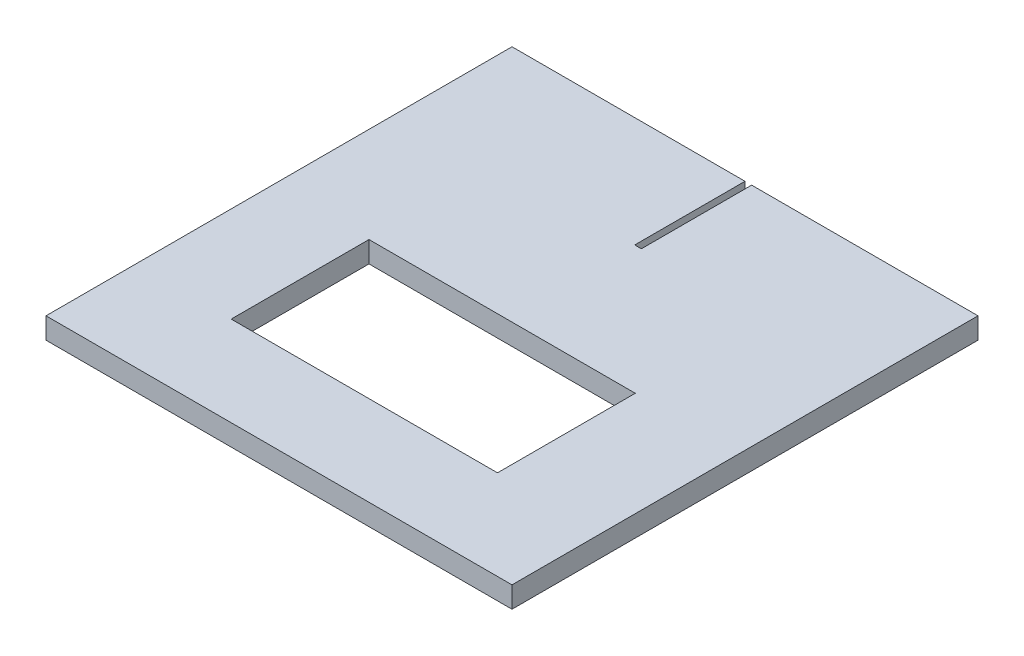
ISO-10303-21;
HEADER;
FILE_DESCRIPTION(('STEP AP214'),'2;1');
FILE_NAME('part.step','',(''),(''),'','','');
FILE_SCHEMA(('AUTOMOTIVE_DESIGN { 1 0 10303 214 1 1 1 1 }'));
ENDSEC;
DATA;
#1=APPLICATION_CONTEXT('core data for automotive mechanical design processes');
#2=APPLICATION_PROTOCOL_DEFINITION('international standard','automotive_design',2000,#1);
#3=PRODUCT_CONTEXT('',#1,'mechanical');
#4=PRODUCT('Part','Part','',(#3));
#5=PRODUCT_RELATED_PRODUCT_CATEGORY('part','',(#4));
#6=PRODUCT_DEFINITION_FORMATION('','',#4);
#7=PRODUCT_DEFINITION_CONTEXT('part definition',#1,'design');
#8=PRODUCT_DEFINITION('design','',#6,#7);
#9=PRODUCT_DEFINITION_SHAPE('','',#8);
#10=(LENGTH_UNIT() NAMED_UNIT(*) SI_UNIT(.MILLI.,.METRE.));
#11=(NAMED_UNIT(*) PLANE_ANGLE_UNIT() SI_UNIT($,.RADIAN.));
#12=(NAMED_UNIT(*) SI_UNIT($,.STERADIAN.) SOLID_ANGLE_UNIT());
#13=UNCERTAINTY_MEASURE_WITH_UNIT(LENGTH_MEASURE(1.E-05),#10,'distance_accuracy_value','');
#14=(GEOMETRIC_REPRESENTATION_CONTEXT(3) GLOBAL_UNCERTAINTY_ASSIGNED_CONTEXT((#13)) GLOBAL_UNIT_ASSIGNED_CONTEXT((#10,
#11,#12)) REPRESENTATION_CONTEXT('',''));
#15=CARTESIAN_POINT('',(0.,0.,0.));
#16=DIRECTION('',(0.,0.,1.));
#17=DIRECTION('',(1.,0.,0.));
#18=AXIS2_PLACEMENT_3D('',#15,#16,#17);
#19=CARTESIAN_POINT('',(-35.,3.175,-35.));
#20=DIRECTION('',(0.,0.,1.));
#21=DIRECTION('',(1.,0.,0.));
#22=AXIS2_PLACEMENT_3D('',#19,#20,#21);
#23=PLANE('',#22);
#24=DIRECTION('',(-1.,0.,0.));
#25=VECTOR('',#24,1.);
#26=CARTESIAN_POINT('',(-35.,3.175,-35.));
#27=LINE('',#26,#25);
#28=CARTESIAN_POINT('',(0.,3.175,-35.));
#29=VERTEX_POINT('',#28);
#30=CARTESIAN_POINT('',(-35.,3.175,-35.));
#31=VERTEX_POINT('',#30);
#32=EDGE_CURVE('E185',#29,#31,#27,.T.);
#33=ORIENTED_EDGE('',*,*,#32,.F.);
#34=DIRECTION('',(0.,1.,0.));
#35=VECTOR('',#34,1.);
#36=CARTESIAN_POINT('',(0.,0.,-35.));
#37=LINE('',#36,#35);
#38=CARTESIAN_POINT('',(0.,0.,-35.));
#39=VERTEX_POINT('',#38);
#40=EDGE_CURVE('E173',#39,#29,#37,.T.);
#41=ORIENTED_EDGE('',*,*,#40,.F.);
#42=DIRECTION('',(-1.,0.,0.));
#43=VECTOR('',#42,1.);
#44=CARTESIAN_POINT('',(-35.,0.,-35.));
#45=LINE('',#44,#43);
#46=CARTESIAN_POINT('',(-35.,0.,-35.));
#47=VERTEX_POINT('',#46);
#48=EDGE_CURVE('E197',#39,#47,#45,.T.);
#49=ORIENTED_EDGE('',*,*,#48,.T.);
#50=DIRECTION('',(0.,-1.,0.));
#51=VECTOR('',#50,1.);
#52=CARTESIAN_POINT('',(-35.,3.175,-35.));
#53=LINE('',#52,#51);
#54=EDGE_CURVE('E40',#31,#47,#53,.T.);
#55=ORIENTED_EDGE('',*,*,#54,.F.);
#56=EDGE_LOOP('',(#33,#41,#49,#55));
#57=FACE_BOUND('',#56,.T.);
#58=ADVANCED_FACE('F32',(#57),#23,.F.);
#59=CARTESIAN_POINT('',(35.,3.175,35.));
#60=DIRECTION('',(-1.,0.,0.));
#61=DIRECTION('',(0.,0.,1.));
#62=AXIS2_PLACEMENT_3D('',#59,#60,#61);
#63=PLANE('',#62);
#64=DIRECTION('',(0.,0.,-1.));
#65=VECTOR('',#64,1.);
#66=CARTESIAN_POINT('',(35.,0.,35.));
#67=LINE('',#66,#65);
#68=CARTESIAN_POINT('',(35.,0.,35.));
#69=VERTEX_POINT('',#68);
#70=CARTESIAN_POINT('',(35.,0.,-35.));
#71=VERTEX_POINT('',#70);
#72=EDGE_CURVE('E175',#69,#71,#67,.T.);
#73=ORIENTED_EDGE('',*,*,#72,.T.);
#74=DIRECTION('',(0.,-1.,0.));
#75=VECTOR('',#74,1.);
#76=CARTESIAN_POINT('',(35.,3.175,-35.));
#77=LINE('',#76,#75);
#78=CARTESIAN_POINT('',(35.,3.175,-35.));
#79=VERTEX_POINT('',#78);
#80=EDGE_CURVE('E11',#79,#71,#77,.T.);
#81=ORIENTED_EDGE('',*,*,#80,.F.);
#82=DIRECTION('',(0.,0.,-1.));
#83=VECTOR('',#82,1.);
#84=CARTESIAN_POINT('',(35.,3.175,35.));
#85=LINE('',#84,#83);
#86=CARTESIAN_POINT('',(35.,3.175,35.));
#87=VERTEX_POINT('',#86);
#88=EDGE_CURVE('E182',#87,#79,#85,.T.);
#89=ORIENTED_EDGE('',*,*,#88,.F.);
#90=DIRECTION('',(0.,-1.,0.));
#91=VECTOR('',#90,1.);
#92=CARTESIAN_POINT('',(35.,3.175,35.));
#93=LINE('',#92,#91);
#94=EDGE_CURVE('E194',#87,#69,#93,.T.);
#95=ORIENTED_EDGE('',*,*,#94,.T.);
#96=EDGE_LOOP('',(#73,#81,#89,#95));
#97=FACE_BOUND('',#96,.T.);
#98=ADVANCED_FACE('F34',(#97),#63,.F.);
#99=CARTESIAN_POINT('',(1.,0.,-35.));
#100=VERTEX_POINT('',#99);
#101=EDGE_CURVE('E198',#71,#100,#45,.T.);
#102=ORIENTED_EDGE('',*,*,#101,.T.);
#103=DIRECTION('',(0.,1.,0.));
#104=VECTOR('',#103,1.);
#105=CARTESIAN_POINT('',(1.,0.,-35.));
#106=LINE('',#105,#104);
#107=CARTESIAN_POINT('',(1.,3.175,-35.));
#108=VERTEX_POINT('',#107);
#109=EDGE_CURVE('E176',#100,#108,#106,.T.);
#110=ORIENTED_EDGE('',*,*,#109,.T.);
#111=EDGE_CURVE('E187',#79,#108,#27,.T.);
#112=ORIENTED_EDGE('',*,*,#111,.F.);
#113=ORIENTED_EDGE('',*,*,#80,.T.);
#114=EDGE_LOOP('',(#102,#110,#112,#113));
#115=FACE_BOUND('',#114,.T.);
#116=ADVANCED_FACE('F242',(#115),#23,.F.);
#117=CARTESIAN_POINT('',(-35.,3.175,35.));
#118=DIRECTION('',(1.,0.,0.));
#119=DIRECTION('',(0.,0.,-1.));
#120=AXIS2_PLACEMENT_3D('',#117,#118,#119);
#121=PLANE('',#120);
#122=DIRECTION('',(0.,0.,1.));
#123=VECTOR('',#122,1.);
#124=CARTESIAN_POINT('',(-35.,0.,35.));
#125=LINE('',#124,#123);
#126=CARTESIAN_POINT('',(-35.,0.,35.));
#127=VERTEX_POINT('',#126);
#128=EDGE_CURVE('E201',#47,#127,#125,.T.);
#129=ORIENTED_EDGE('',*,*,#128,.T.);
#130=DIRECTION('',(0.,-1.,0.));
#131=VECTOR('',#130,1.);
#132=CARTESIAN_POINT('',(-35.,3.175,35.));
#133=LINE('',#132,#131);
#134=CARTESIAN_POINT('',(-35.,3.175,35.));
#135=VERTEX_POINT('',#134);
#136=EDGE_CURVE('E206',#135,#127,#133,.T.);
#137=ORIENTED_EDGE('',*,*,#136,.F.);
#138=DIRECTION('',(0.,0.,1.));
#139=VECTOR('',#138,1.);
#140=CARTESIAN_POINT('',(-35.,3.175,35.));
#141=LINE('',#140,#139);
#142=EDGE_CURVE('E190',#31,#135,#141,.T.);
#143=ORIENTED_EDGE('',*,*,#142,.F.);
#144=ORIENTED_EDGE('',*,*,#54,.T.);
#145=EDGE_LOOP('',(#129,#137,#143,#144));
#146=FACE_BOUND('',#145,.T.);
#147=ADVANCED_FACE('F213',(#146),#121,.F.);
#148=CARTESIAN_POINT('',(-35.,3.175,35.));
#149=DIRECTION('',(0.,0.,-1.));
#150=DIRECTION('',(-1.,0.,0.));
#151=AXIS2_PLACEMENT_3D('',#148,#149,#150);
#152=PLANE('',#151);
#153=DIRECTION('',(1.,0.,0.));
#154=VECTOR('',#153,1.);
#155=CARTESIAN_POINT('',(-35.,0.,35.));
#156=LINE('',#155,#154);
#157=EDGE_CURVE('E186',#127,#69,#156,.T.);
#158=ORIENTED_EDGE('',*,*,#157,.T.);
#159=ORIENTED_EDGE('',*,*,#94,.F.);
#160=DIRECTION('',(1.,0.,0.));
#161=VECTOR('',#160,1.);
#162=CARTESIAN_POINT('',(-35.,3.175,35.));
#163=LINE('',#162,#161);
#164=EDGE_CURVE('E192',#135,#87,#163,.T.);
#165=ORIENTED_EDGE('',*,*,#164,.F.);
#166=ORIENTED_EDGE('',*,*,#136,.T.);
#167=EDGE_LOOP('',(#158,#159,#165,#166));
#168=FACE_BOUND('',#167,.T.);
#169=ADVANCED_FACE('F224',(#168),#152,.F.);
#170=CARTESIAN_POINT('',(0.,3.175,0.));
#171=DIRECTION('',(0.,-1.,0.));
#172=DIRECTION('',(0.,0.,-1.));
#173=AXIS2_PLACEMENT_3D('',#170,#171,#172);
#174=PLANE('',#173);
#175=DIRECTION('',(-1.,0.,0.));
#176=VECTOR('',#175,1.);
#177=CARTESIAN_POINT('',(19.337359504229,3.175,0.8181190559482));
#178=LINE('',#177,#176);
#179=CARTESIAN_POINT('',(19.337359504229,3.175,0.8181190559482));
#180=VERTEX_POINT('',#179);
#181=CARTESIAN_POINT('',(-20.662640495771,3.175,0.8181190559482));
#182=VERTEX_POINT('',#181);
#183=EDGE_CURVE('E126',#180,#182,#178,.T.);
#184=ORIENTED_EDGE('',*,*,#183,.F.);
#185=DIRECTION('',(0.,0.,1.));
#186=VECTOR('',#185,1.);
#187=CARTESIAN_POINT('',(19.337359504229,3.175,0.8181190559482));
#188=LINE('',#187,#186);
#189=CARTESIAN_POINT('',(19.337359504229,3.175,21.5181190559482));
#190=VERTEX_POINT('',#189);
#191=EDGE_CURVE('E123',#180,#190,#188,.T.);
#192=ORIENTED_EDGE('',*,*,#191,.T.);
#193=DIRECTION('',(-1.,0.,0.));
#194=VECTOR('',#193,1.);
#195=CARTESIAN_POINT('',(19.337359504229,3.175,21.5181190559482));
#196=LINE('',#195,#194);
#197=CARTESIAN_POINT('',(-20.662640495771,3.175,21.5181190559482));
#198=VERTEX_POINT('',#197);
#199=EDGE_CURVE('E129',#190,#198,#196,.T.);
#200=ORIENTED_EDGE('',*,*,#199,.T.);
#201=DIRECTION('',(0.,0.,1.));
#202=VECTOR('',#201,1.);
#203=CARTESIAN_POINT('',(-20.662640495771,3.175,0.8181190559482));
#204=LINE('',#203,#202);
#205=EDGE_CURVE('E133',#182,#198,#204,.T.);
#206=ORIENTED_EDGE('',*,*,#205,.F.);
#207=EDGE_LOOP('',(#184,#192,#200,#206));
#208=FACE_BOUND('',#207,.T.);
#209=DIRECTION('',(1.,0.,0.));
#210=VECTOR('',#209,1.);
#211=CARTESIAN_POINT('',(0.,3.175,-18.4362981700651));
#212=LINE('',#211,#210);
#213=CARTESIAN_POINT('',(0.,3.175,-18.4362981700651));
#214=VERTEX_POINT('',#213);
#215=CARTESIAN_POINT('',(1.,3.175,-18.4362981700651));
#216=VERTEX_POINT('',#215);
#217=EDGE_CURVE('E169',#214,#216,#212,.T.);
#218=ORIENTED_EDGE('',*,*,#217,.F.);
#219=DIRECTION('',(0.,0.,1.));
#220=VECTOR('',#219,1.);
#221=CARTESIAN_POINT('',(0.,3.175,-35.));
#222=LINE('',#221,#220);
#223=EDGE_CURVE('E152',#29,#214,#222,.T.);
#224=ORIENTED_EDGE('',*,*,#223,.F.);
#225=ORIENTED_EDGE('',*,*,#32,.T.);
#226=ORIENTED_EDGE('',*,*,#142,.T.);
#227=ORIENTED_EDGE('',*,*,#164,.T.);
#228=ORIENTED_EDGE('',*,*,#88,.T.);
#229=ORIENTED_EDGE('',*,*,#111,.T.);
#230=DIRECTION('',(0.,0.,-1.));
#231=VECTOR('',#230,1.);
#232=CARTESIAN_POINT('',(1.,3.175,-35.));
#233=LINE('',#232,#231);
#234=EDGE_CURVE('E160',#216,#108,#233,.T.);
#235=ORIENTED_EDGE('',*,*,#234,.F.);
#236=EDGE_LOOP('',(#218,#224,#225,#226,#227,#228,#229,#235));
#237=FACE_BOUND('',#236,.T.);
#238=ADVANCED_FACE('F135',(#208,#237),#174,.F.);
#239=CARTESIAN_POINT('',(0.,0.,0.));
#240=DIRECTION('',(0.,-1.,0.));
#241=DIRECTION('',(0.,0.,-1.));
#242=AXIS2_PLACEMENT_3D('',#239,#240,#241);
#243=PLANE('',#242);
#244=DIRECTION('',(0.,0.,1.));
#245=VECTOR('',#244,1.);
#246=CARTESIAN_POINT('',(19.337359504229,0.,0.8181190559482));
#247=LINE('',#246,#245);
#248=CARTESIAN_POINT('',(19.337359504229,0.,0.8181190559482));
#249=VERTEX_POINT('',#248);
#250=CARTESIAN_POINT('',(19.337359504229,0.,21.5181190559482));
#251=VERTEX_POINT('',#250);
#252=EDGE_CURVE('E55',#249,#251,#247,.T.);
#253=ORIENTED_EDGE('',*,*,#252,.F.);
#254=DIRECTION('',(-1.,0.,0.));
#255=VECTOR('',#254,1.);
#256=CARTESIAN_POINT('',(19.337359504229,0.,0.8181190559482));
#257=LINE('',#256,#255);
#258=CARTESIAN_POINT('',(-20.662640495771,0.,0.8181190559482));
#259=VERTEX_POINT('',#258);
#260=EDGE_CURVE('E137',#249,#259,#257,.T.);
#261=ORIENTED_EDGE('',*,*,#260,.T.);
#262=DIRECTION('',(0.,0.,1.));
#263=VECTOR('',#262,1.);
#264=CARTESIAN_POINT('',(-20.662640495771,0.,0.8181190559482));
#265=LINE('',#264,#263);
#266=CARTESIAN_POINT('',(-20.662640495771,0.,21.5181190559482));
#267=VERTEX_POINT('',#266);
#268=EDGE_CURVE('E140',#259,#267,#265,.T.);
#269=ORIENTED_EDGE('',*,*,#268,.T.);
#270=DIRECTION('',(-1.,0.,0.));
#271=VECTOR('',#270,1.);
#272=CARTESIAN_POINT('',(19.337359504229,0.,21.5181190559482));
#273=LINE('',#272,#271);
#274=EDGE_CURVE('E146',#251,#267,#273,.T.);
#275=ORIENTED_EDGE('',*,*,#274,.F.);
#276=EDGE_LOOP('',(#253,#261,#269,#275));
#277=FACE_BOUND('',#276,.T.);
#278=DIRECTION('',(0.,0.,1.));
#279=VECTOR('',#278,1.);
#280=CARTESIAN_POINT('',(0.,0.,-35.));
#281=LINE('',#280,#279);
#282=CARTESIAN_POINT('',(0.,0.,-18.4362981700651));
#283=VERTEX_POINT('',#282);
#284=EDGE_CURVE('E156',#39,#283,#281,.T.);
#285=ORIENTED_EDGE('',*,*,#284,.T.);
#286=DIRECTION('',(1.,0.,0.));
#287=VECTOR('',#286,1.);
#288=CARTESIAN_POINT('',(0.,0.,-18.4362981700651));
#289=LINE('',#288,#287);
#290=CARTESIAN_POINT('',(1.,0.,-18.4362981700651));
#291=VERTEX_POINT('',#290);
#292=EDGE_CURVE('E159',#283,#291,#289,.T.);
#293=ORIENTED_EDGE('',*,*,#292,.T.);
#294=DIRECTION('',(0.,0.,-1.));
#295=VECTOR('',#294,1.);
#296=CARTESIAN_POINT('',(1.,0.,-35.));
#297=LINE('',#296,#295);
#298=EDGE_CURVE('E163',#291,#100,#297,.T.);
#299=ORIENTED_EDGE('',*,*,#298,.T.);
#300=ORIENTED_EDGE('',*,*,#101,.F.);
#301=ORIENTED_EDGE('',*,*,#72,.F.);
#302=ORIENTED_EDGE('',*,*,#157,.F.);
#303=ORIENTED_EDGE('',*,*,#128,.F.);
#304=ORIENTED_EDGE('',*,*,#48,.F.);
#305=EDGE_LOOP('',(#285,#293,#299,#300,#301,#302,#303,#304));
#306=FACE_BOUND('',#305,.T.);
#307=ADVANCED_FACE('F220',(#277,#306),#243,.T.);
#308=CARTESIAN_POINT('',(0.,0.,-35.));
#309=DIRECTION('',(-1.,0.,0.));
#310=DIRECTION('',(0.,0.,1.));
#311=AXIS2_PLACEMENT_3D('',#308,#309,#310);
#312=PLANE('',#311);
#313=ORIENTED_EDGE('',*,*,#223,.T.);
#314=DIRECTION('',(0.,1.,0.));
#315=VECTOR('',#314,1.);
#316=CARTESIAN_POINT('',(0.,0.,-18.4362981700651));
#317=LINE('',#316,#315);
#318=EDGE_CURVE('E166',#283,#214,#317,.T.);
#319=ORIENTED_EDGE('',*,*,#318,.F.);
#320=ORIENTED_EDGE('',*,*,#284,.F.);
#321=ORIENTED_EDGE('',*,*,#40,.T.);
#322=EDGE_LOOP('',(#313,#319,#320,#321));
#323=FACE_BOUND('',#322,.T.);
#324=ADVANCED_FACE('F234',(#323),#312,.F.);
#325=CARTESIAN_POINT('',(1.,0.,-35.));
#326=DIRECTION('',(1.,0.,0.));
#327=DIRECTION('',(0.,0.,-1.));
#328=AXIS2_PLACEMENT_3D('',#325,#326,#327);
#329=PLANE('',#328);
#330=ORIENTED_EDGE('',*,*,#234,.T.);
#331=ORIENTED_EDGE('',*,*,#109,.F.);
#332=ORIENTED_EDGE('',*,*,#298,.F.);
#333=DIRECTION('',(0.,1.,0.));
#334=VECTOR('',#333,1.);
#335=CARTESIAN_POINT('',(1.,0.,-18.4362981700651));
#336=LINE('',#335,#334);
#337=EDGE_CURVE('E179',#291,#216,#336,.T.);
#338=ORIENTED_EDGE('',*,*,#337,.T.);
#339=EDGE_LOOP('',(#330,#331,#332,#338));
#340=FACE_BOUND('',#339,.T.);
#341=ADVANCED_FACE('F240',(#340),#329,.F.);
#342=CARTESIAN_POINT('',(0.,0.,-18.4362981700651));
#343=DIRECTION('',(0.,0.,1.));
#344=DIRECTION('',(1.,0.,0.));
#345=AXIS2_PLACEMENT_3D('',#342,#343,#344);
#346=PLANE('',#345);
#347=ORIENTED_EDGE('',*,*,#217,.T.);
#348=ORIENTED_EDGE('',*,*,#337,.F.);
#349=ORIENTED_EDGE('',*,*,#292,.F.);
#350=ORIENTED_EDGE('',*,*,#318,.T.);
#351=EDGE_LOOP('',(#347,#348,#349,#350));
#352=FACE_BOUND('',#351,.T.);
#353=ADVANCED_FACE('F238',(#352),#346,.F.);
#354=CARTESIAN_POINT('',(19.337359504229,3.175,0.8181190559482));
#355=DIRECTION('',(1.,0.,0.));
#356=DIRECTION('',(0.,0.,-1.));
#357=AXIS2_PLACEMENT_3D('',#354,#355,#356);
#358=PLANE('',#357);
#359=ORIENTED_EDGE('',*,*,#252,.T.);
#360=DIRECTION('',(0.,-1.,0.));
#361=VECTOR('',#360,1.);
#362=CARTESIAN_POINT('',(19.337359504229,3.175,21.5181190559482));
#363=LINE('',#362,#361);
#364=EDGE_CURVE('E120',#190,#251,#363,.T.);
#365=ORIENTED_EDGE('',*,*,#364,.F.);
#366=ORIENTED_EDGE('',*,*,#191,.F.);
#367=DIRECTION('',(0.,-1.,0.));
#368=VECTOR('',#367,1.);
#369=CARTESIAN_POINT('',(19.337359504229,3.175,0.8181190559482));
#370=LINE('',#369,#368);
#371=EDGE_CURVE('E150',#180,#249,#370,.T.);
#372=ORIENTED_EDGE('',*,*,#371,.T.);
#373=EDGE_LOOP('',(#359,#365,#366,#372));
#374=FACE_BOUND('',#373,.T.);
#375=ADVANCED_FACE('F121',(#374),#358,.F.);
#376=CARTESIAN_POINT('',(19.337359504229,3.175,0.8181190559482));
#377=DIRECTION('',(0.,0.,1.));
#378=DIRECTION('',(1.,0.,0.));
#379=AXIS2_PLACEMENT_3D('',#376,#377,#378);
#380=PLANE('',#379);
#381=ORIENTED_EDGE('',*,*,#260,.F.);
#382=ORIENTED_EDGE('',*,*,#371,.F.);
#383=ORIENTED_EDGE('',*,*,#183,.T.);
#384=DIRECTION('',(0.,-1.,0.));
#385=VECTOR('',#384,1.);
#386=CARTESIAN_POINT('',(-20.662640495771,3.175,0.8181190559482));
#387=LINE('',#386,#385);
#388=EDGE_CURVE('E153',#182,#259,#387,.T.);
#389=ORIENTED_EDGE('',*,*,#388,.T.);
#390=EDGE_LOOP('',(#381,#382,#383,#389));
#391=FACE_BOUND('',#390,.T.);
#392=ADVANCED_FACE('F314',(#391),#380,.T.);
#393=CARTESIAN_POINT('',(-20.662640495771,3.175,0.8181190559482));
#394=DIRECTION('',(1.,0.,0.));
#395=DIRECTION('',(0.,0.,-1.));
#396=AXIS2_PLACEMENT_3D('',#393,#394,#395);
#397=PLANE('',#396);
#398=ORIENTED_EDGE('',*,*,#268,.F.);
#399=ORIENTED_EDGE('',*,*,#388,.F.);
#400=ORIENTED_EDGE('',*,*,#205,.T.);
#401=DIRECTION('',(0.,-1.,0.));
#402=VECTOR('',#401,1.);
#403=CARTESIAN_POINT('',(-20.662640495771,3.175,21.5181190559482));
#404=LINE('',#403,#402);
#405=EDGE_CURVE('E47',#198,#267,#404,.T.);
#406=ORIENTED_EDGE('',*,*,#405,.T.);
#407=EDGE_LOOP('',(#398,#399,#400,#406));
#408=FACE_BOUND('',#407,.T.);
#409=ADVANCED_FACE('F321',(#408),#397,.T.);
#410=CARTESIAN_POINT('',(19.337359504229,3.175,21.5181190559482));
#411=DIRECTION('',(0.,0.,1.));
#412=DIRECTION('',(1.,0.,0.));
#413=AXIS2_PLACEMENT_3D('',#410,#411,#412);
#414=PLANE('',#413);
#415=ORIENTED_EDGE('',*,*,#274,.T.);
#416=ORIENTED_EDGE('',*,*,#405,.F.);
#417=ORIENTED_EDGE('',*,*,#199,.F.);
#418=ORIENTED_EDGE('',*,*,#364,.T.);
#419=EDGE_LOOP('',(#415,#416,#417,#418));
#420=FACE_BOUND('',#419,.T.);
#421=ADVANCED_FACE('F130',(#420),#414,.F.);
#422=CLOSED_SHELL('',(#58,#98,#116,#147,#169,#238,#307,#324,#341,#353,#375,#392,#409,#421));
#423=MANIFOLD_SOLID_BREP('B2',#422);
#424=ADVANCED_BREP_SHAPE_REPRESENTATION('',(#18,#423),#14);
#425=SHAPE_DEFINITION_REPRESENTATION(#9,#424);
ENDSEC;
END-ISO-10303-21;
